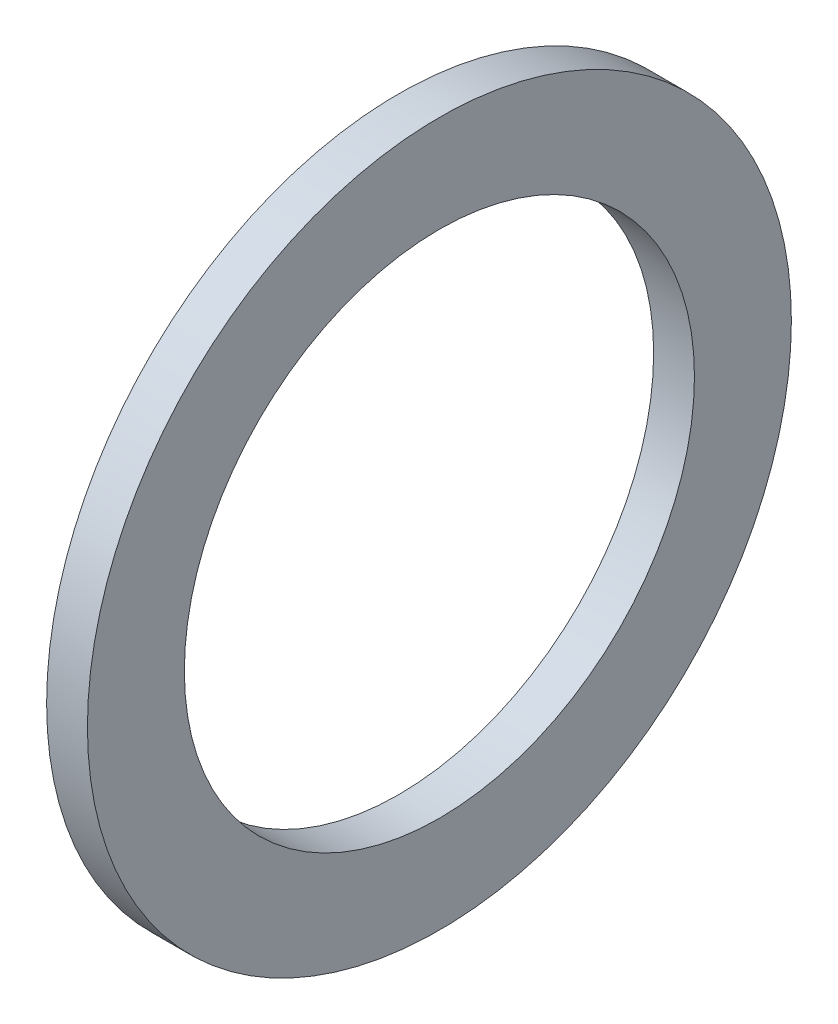
ISO-10303-21;
HEADER;
FILE_DESCRIPTION(('STEP AP214'),'2;1');
FILE_NAME('part.step','',(''),(''),'','','');
FILE_SCHEMA(('AUTOMOTIVE_DESIGN { 1 0 10303 214 1 1 1 1 }'));
ENDSEC;
DATA;
#1=APPLICATION_CONTEXT('core data for automotive mechanical design processes');
#2=APPLICATION_PROTOCOL_DEFINITION('international standard','automotive_design',2000,#1);
#3=PRODUCT_CONTEXT('',#1,'mechanical');
#4=PRODUCT('Part','Part','',(#3));
#5=PRODUCT_RELATED_PRODUCT_CATEGORY('part','',(#4));
#6=PRODUCT_DEFINITION_FORMATION('','',#4);
#7=PRODUCT_DEFINITION_CONTEXT('part definition',#1,'design');
#8=PRODUCT_DEFINITION('design','',#6,#7);
#9=PRODUCT_DEFINITION_SHAPE('','',#8);
#10=(LENGTH_UNIT() NAMED_UNIT(*) SI_UNIT(.MILLI.,.METRE.));
#11=(NAMED_UNIT(*) PLANE_ANGLE_UNIT() SI_UNIT($,.RADIAN.));
#12=(NAMED_UNIT(*) SI_UNIT($,.STERADIAN.) SOLID_ANGLE_UNIT());
#13=UNCERTAINTY_MEASURE_WITH_UNIT(LENGTH_MEASURE(1.E-05),#10,'distance_accuracy_value','');
#14=(GEOMETRIC_REPRESENTATION_CONTEXT(3) GLOBAL_UNCERTAINTY_ASSIGNED_CONTEXT((#13)) GLOBAL_UNIT_ASSIGNED_CONTEXT((#10,
#11,#12)) REPRESENTATION_CONTEXT('',''));
#15=CARTESIAN_POINT('',(0.,0.,0.));
#16=DIRECTION('',(0.,0.,1.));
#17=DIRECTION('',(1.,0.,0.));
#18=AXIS2_PLACEMENT_3D('',#15,#16,#17);
#19=CARTESIAN_POINT('',(1.016,0.,0.));
#20=DIRECTION('',(1.,0.,0.));
#21=DIRECTION('',(0.,0.,-1.));
#22=AXIS2_PLACEMENT_3D('',#19,#20,#21);
#23=PLANE('',#22);
#24=CARTESIAN_POINT('',(1.016,0.,0.));
#25=DIRECTION('',(1.,0.,0.));
#26=DIRECTION('',(0.,0.,-1.));
#27=AXIS2_PLACEMENT_3D('',#24,#25,#26);
#28=CIRCLE('',#27,8.763);
#29=CARTESIAN_POINT('',(1.016,0.,-8.763));
#30=VERTEX_POINT('',#29);
#31=EDGE_CURVE('E10',#30,#30,#28,.T.);
#32=ORIENTED_EDGE('',*,*,#31,.T.);
#33=EDGE_LOOP('',(#32));
#34=FACE_BOUND('',#33,.T.);
#35=CARTESIAN_POINT('',(1.016,0.,0.));
#36=DIRECTION('',(1.,0.,0.));
#37=DIRECTION('',(0.,0.,-1.));
#38=AXIS2_PLACEMENT_3D('',#35,#36,#37);
#39=CIRCLE('',#38,6.35);
#40=CARTESIAN_POINT('',(1.016,0.,-6.35));
#41=VERTEX_POINT('',#40);
#42=EDGE_CURVE('E42',#41,#41,#39,.T.);
#43=ORIENTED_EDGE('',*,*,#42,.F.);
#44=EDGE_LOOP('',(#43));
#45=FACE_BOUND('',#44,.T.);
#46=ADVANCED_FACE('F31',(#34,#45),#23,.T.);
#47=CARTESIAN_POINT('',(0.,0.,0.));
#48=DIRECTION('',(1.,0.,0.));
#49=DIRECTION('',(0.,0.,-1.));
#50=AXIS2_PLACEMENT_3D('',#47,#48,#49);
#51=PLANE('',#50);
#52=CARTESIAN_POINT('',(0.,0.,0.));
#53=DIRECTION('',(1.,0.,0.));
#54=DIRECTION('',(0.,0.,-1.));
#55=AXIS2_PLACEMENT_3D('',#52,#53,#54);
#56=CIRCLE('',#55,8.763);
#57=CARTESIAN_POINT('',(0.,0.,-8.763));
#58=VERTEX_POINT('',#57);
#59=EDGE_CURVE('E35',#58,#58,#56,.T.);
#60=ORIENTED_EDGE('',*,*,#59,.F.);
#61=EDGE_LOOP('',(#60));
#62=FACE_BOUND('',#61,.T.);
#63=CARTESIAN_POINT('',(0.,0.,0.));
#64=DIRECTION('',(1.,0.,0.));
#65=DIRECTION('',(0.,0.,-1.));
#66=AXIS2_PLACEMENT_3D('',#63,#64,#65);
#67=CIRCLE('',#66,6.35);
#68=CARTESIAN_POINT('',(0.,0.,-6.35));
#69=VERTEX_POINT('',#68);
#70=EDGE_CURVE('E44',#69,#69,#67,.T.);
#71=ORIENTED_EDGE('',*,*,#70,.T.);
#72=EDGE_LOOP('',(#71));
#73=FACE_BOUND('',#72,.T.);
#74=ADVANCED_FACE('F54',(#62,#73),#51,.F.);
#75=CARTESIAN_POINT('',(1.016,0.,0.));
#76=DIRECTION('',(-1.,0.,0.));
#77=DIRECTION('',(0.,0.,1.));
#78=AXIS2_PLACEMENT_3D('',#75,#76,#77);
#79=CYLINDRICAL_SURFACE('',#78,8.763);
#80=ORIENTED_EDGE('',*,*,#31,.F.);
#81=EDGE_LOOP('',(#80));
#82=FACE_BOUND('',#81,.T.);
#83=ORIENTED_EDGE('',*,*,#59,.T.);
#84=EDGE_LOOP('',(#83));
#85=FACE_BOUND('',#84,.T.);
#86=ADVANCED_FACE('F33',(#82,#85),#79,.T.);
#87=CARTESIAN_POINT('',(1.016,0.,0.));
#88=DIRECTION('',(-1.,0.,0.));
#89=DIRECTION('',(0.,0.,1.));
#90=AXIS2_PLACEMENT_3D('',#87,#88,#89);
#91=CYLINDRICAL_SURFACE('',#90,6.35);
#92=ORIENTED_EDGE('',*,*,#42,.T.);
#93=EDGE_LOOP('',(#92));
#94=FACE_BOUND('',#93,.T.);
#95=ORIENTED_EDGE('',*,*,#70,.F.);
#96=EDGE_LOOP('',(#95));
#97=FACE_BOUND('',#96,.T.);
#98=ADVANCED_FACE('F50',(#94,#97),#91,.F.);
#99=CLOSED_SHELL('',(#46,#74,#86,#98));
#100=MANIFOLD_SOLID_BREP('B2',#99);
#101=ADVANCED_BREP_SHAPE_REPRESENTATION('',(#18,#100),#14);
#102=SHAPE_DEFINITION_REPRESENTATION(#9,#101);
ENDSEC;
END-ISO-10303-21;
